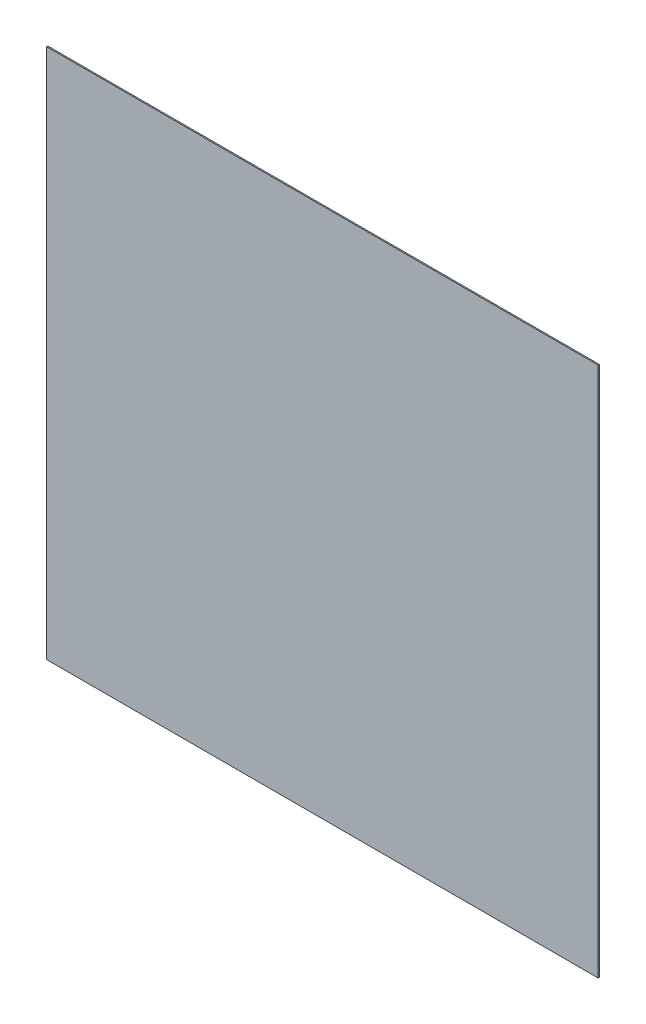
ISO-10303-21;
HEADER;
FILE_DESCRIPTION(('STEP AP214'),'2;1');
FILE_NAME('part.step','',(''),(''),'','','');
FILE_SCHEMA(('AUTOMOTIVE_DESIGN { 1 0 10303 214 1 1 1 1 }'));
ENDSEC;
DATA;
#1=APPLICATION_CONTEXT('core data for automotive mechanical design processes');
#2=APPLICATION_PROTOCOL_DEFINITION('international standard','automotive_design',2000,#1);
#3=PRODUCT_CONTEXT('',#1,'mechanical');
#4=PRODUCT('Part','Part','',(#3));
#5=PRODUCT_RELATED_PRODUCT_CATEGORY('part','',(#4));
#6=PRODUCT_DEFINITION_FORMATION('','',#4);
#7=PRODUCT_DEFINITION_CONTEXT('part definition',#1,'design');
#8=PRODUCT_DEFINITION('design','',#6,#7);
#9=PRODUCT_DEFINITION_SHAPE('','',#8);
#10=(LENGTH_UNIT() NAMED_UNIT(*) SI_UNIT(.MILLI.,.METRE.));
#11=(NAMED_UNIT(*) PLANE_ANGLE_UNIT() SI_UNIT($,.RADIAN.));
#12=(NAMED_UNIT(*) SI_UNIT($,.STERADIAN.) SOLID_ANGLE_UNIT());
#13=UNCERTAINTY_MEASURE_WITH_UNIT(LENGTH_MEASURE(1.E-05),#10,'distance_accuracy_value','');
#14=(GEOMETRIC_REPRESENTATION_CONTEXT(3) GLOBAL_UNCERTAINTY_ASSIGNED_CONTEXT((#13)) GLOBAL_UNIT_ASSIGNED_CONTEXT((#10,
#11,#12)) REPRESENTATION_CONTEXT('',''));
#15=CARTESIAN_POINT('',(0.,0.,0.));
#16=DIRECTION('',(0.,0.,1.));
#17=DIRECTION('',(1.,0.,0.));
#18=AXIS2_PLACEMENT_3D('',#15,#16,#17);
#19=CARTESIAN_POINT('',(0.,0.,2.));
#20=DIRECTION('',(1.,0.,0.));
#21=DIRECTION('',(0.,0.,-1.));
#22=AXIS2_PLACEMENT_3D('',#19,#20,#21);
#23=PLANE('',#22);
#24=DIRECTION('',(0.,-1.,0.));
#25=VECTOR('',#24,1.);
#26=CARTESIAN_POINT('',(0.,0.,0.));
#27=LINE('',#26,#25);
#28=CARTESIAN_POINT('',(0.,900.,0.));
#29=VERTEX_POINT('',#28);
#30=CARTESIAN_POINT('',(0.,0.,0.));
#31=VERTEX_POINT('',#30);
#32=EDGE_CURVE('E100',#29,#31,#27,.T.);
#33=ORIENTED_EDGE('',*,*,#32,.T.);
#34=DIRECTION('',(0.,0.,-1.));
#35=VECTOR('',#34,1.);
#36=CARTESIAN_POINT('',(0.,0.,2.));
#37=LINE('',#36,#35);
#38=CARTESIAN_POINT('',(0.,0.,2.));
#39=VERTEX_POINT('',#38);
#40=EDGE_CURVE('E11',#39,#31,#37,.T.);
#41=ORIENTED_EDGE('',*,*,#40,.F.);
#42=DIRECTION('',(0.,-1.,0.));
#43=VECTOR('',#42,1.);
#44=CARTESIAN_POINT('',(0.,0.,2.));
#45=LINE('',#44,#43);
#46=CARTESIAN_POINT('',(0.,900.,2.));
#47=VERTEX_POINT('',#46);
#48=EDGE_CURVE('E88',#47,#39,#45,.T.);
#49=ORIENTED_EDGE('',*,*,#48,.F.);
#50=DIRECTION('',(0.,0.,-1.));
#51=VECTOR('',#50,1.);
#52=CARTESIAN_POINT('',(0.,900.,2.));
#53=LINE('',#52,#51);
#54=EDGE_CURVE('E96',#47,#29,#53,.T.);
#55=ORIENTED_EDGE('',*,*,#54,.T.);
#56=EDGE_LOOP('',(#33,#41,#49,#55));
#57=FACE_BOUND('',#56,.T.);
#58=ADVANCED_FACE('F37',(#57),#23,.F.);
#59=CARTESIAN_POINT('',(0.,0.,2.));
#60=DIRECTION('',(0.,1.,0.));
#61=DIRECTION('',(0.,0.,1.));
#62=AXIS2_PLACEMENT_3D('',#59,#60,#61);
#63=PLANE('',#62);
#64=DIRECTION('',(1.,0.,0.));
#65=VECTOR('',#64,1.);
#66=CARTESIAN_POINT('',(0.,0.,0.));
#67=LINE('',#66,#65);
#68=CARTESIAN_POINT('',(935.,0.,0.));
#69=VERTEX_POINT('',#68);
#70=EDGE_CURVE('E92',#31,#69,#67,.T.);
#71=ORIENTED_EDGE('',*,*,#70,.T.);
#72=DIRECTION('',(0.,0.,-1.));
#73=VECTOR('',#72,1.);
#74=CARTESIAN_POINT('',(935.,0.,2.));
#75=LINE('',#74,#73);
#76=CARTESIAN_POINT('',(935.,0.,2.));
#77=VERTEX_POINT('',#76);
#78=EDGE_CURVE('E45',#77,#69,#75,.T.);
#79=ORIENTED_EDGE('',*,*,#78,.F.);
#80=DIRECTION('',(1.,0.,0.));
#81=VECTOR('',#80,1.);
#82=CARTESIAN_POINT('',(0.,0.,2.));
#83=LINE('',#82,#81);
#84=EDGE_CURVE('E83',#39,#77,#83,.T.);
#85=ORIENTED_EDGE('',*,*,#84,.F.);
#86=ORIENTED_EDGE('',*,*,#40,.T.);
#87=EDGE_LOOP('',(#71,#79,#85,#86));
#88=FACE_BOUND('',#87,.T.);
#89=ADVANCED_FACE('F91',(#88),#63,.F.);
#90=CARTESIAN_POINT('',(935.,0.,2.));
#91=DIRECTION('',(-1.,0.,0.));
#92=DIRECTION('',(0.,0.,1.));
#93=AXIS2_PLACEMENT_3D('',#90,#91,#92);
#94=PLANE('',#93);
#95=DIRECTION('',(0.,1.,0.));
#96=VECTOR('',#95,1.);
#97=CARTESIAN_POINT('',(935.,0.,0.));
#98=LINE('',#97,#96);
#99=CARTESIAN_POINT('',(935.,900.,0.));
#100=VERTEX_POINT('',#99);
#101=EDGE_CURVE('E70',#69,#100,#98,.T.);
#102=ORIENTED_EDGE('',*,*,#101,.T.);
#103=DIRECTION('',(0.,0.,-1.));
#104=VECTOR('',#103,1.);
#105=CARTESIAN_POINT('',(935.,900.,2.));
#106=LINE('',#105,#104);
#107=CARTESIAN_POINT('',(935.,900.,2.));
#108=VERTEX_POINT('',#107);
#109=EDGE_CURVE('E93',#108,#100,#106,.T.);
#110=ORIENTED_EDGE('',*,*,#109,.F.);
#111=DIRECTION('',(0.,1.,0.));
#112=VECTOR('',#111,1.);
#113=CARTESIAN_POINT('',(935.,0.,2.));
#114=LINE('',#113,#112);
#115=EDGE_CURVE('E86',#77,#108,#114,.T.);
#116=ORIENTED_EDGE('',*,*,#115,.F.);
#117=ORIENTED_EDGE('',*,*,#78,.T.);
#118=EDGE_LOOP('',(#102,#110,#116,#117));
#119=FACE_BOUND('',#118,.T.);
#120=ADVANCED_FACE('F94',(#119),#94,.F.);
#121=CARTESIAN_POINT('',(0.,900.,2.));
#122=DIRECTION('',(0.,-1.,0.));
#123=DIRECTION('',(0.,0.,-1.));
#124=AXIS2_PLACEMENT_3D('',#121,#122,#123);
#125=PLANE('',#124);
#126=DIRECTION('',(-1.,0.,0.));
#127=VECTOR('',#126,1.);
#128=CARTESIAN_POINT('',(0.,900.,0.));
#129=LINE('',#128,#127);
#130=EDGE_CURVE('E76',#100,#29,#129,.T.);
#131=ORIENTED_EDGE('',*,*,#130,.T.);
#132=ORIENTED_EDGE('',*,*,#54,.F.);
#133=DIRECTION('',(-1.,0.,0.));
#134=VECTOR('',#133,1.);
#135=CARTESIAN_POINT('',(0.,900.,2.));
#136=LINE('',#135,#134);
#137=EDGE_CURVE('E53',#108,#47,#136,.T.);
#138=ORIENTED_EDGE('',*,*,#137,.F.);
#139=ORIENTED_EDGE('',*,*,#109,.T.);
#140=EDGE_LOOP('',(#131,#132,#138,#139));
#141=FACE_BOUND('',#140,.T.);
#142=ADVANCED_FACE('F107',(#141),#125,.F.);
#143=CARTESIAN_POINT('',(0.,0.,2.));
#144=DIRECTION('',(0.,0.,-1.));
#145=DIRECTION('',(-1.,0.,0.));
#146=AXIS2_PLACEMENT_3D('',#143,#144,#145);
#147=PLANE('',#146);
#148=ORIENTED_EDGE('',*,*,#48,.T.);
#149=ORIENTED_EDGE('',*,*,#84,.T.);
#150=ORIENTED_EDGE('',*,*,#115,.T.);
#151=ORIENTED_EDGE('',*,*,#137,.T.);
#152=EDGE_LOOP('',(#148,#149,#150,#151));
#153=FACE_BOUND('',#152,.T.);
#154=ADVANCED_FACE('F84',(#153),#147,.F.);
#155=CARTESIAN_POINT('',(0.,0.,0.));
#156=DIRECTION('',(0.,0.,-1.));
#157=DIRECTION('',(-1.,0.,0.));
#158=AXIS2_PLACEMENT_3D('',#155,#156,#157);
#159=PLANE('',#158);
#160=ORIENTED_EDGE('',*,*,#32,.F.);
#161=ORIENTED_EDGE('',*,*,#130,.F.);
#162=ORIENTED_EDGE('',*,*,#101,.F.);
#163=ORIENTED_EDGE('',*,*,#70,.F.);
#164=EDGE_LOOP('',(#160,#161,#162,#163));
#165=FACE_BOUND('',#164,.T.);
#166=ADVANCED_FACE('F110',(#165),#159,.T.);
#167=CLOSED_SHELL('',(#58,#89,#120,#142,#154,#166));
#168=MANIFOLD_SOLID_BREP('B2',#167);
#169=ADVANCED_BREP_SHAPE_REPRESENTATION('',(#18,#168),#14);
#170=SHAPE_DEFINITION_REPRESENTATION(#9,#169);
ENDSEC;
END-ISO-10303-21;
